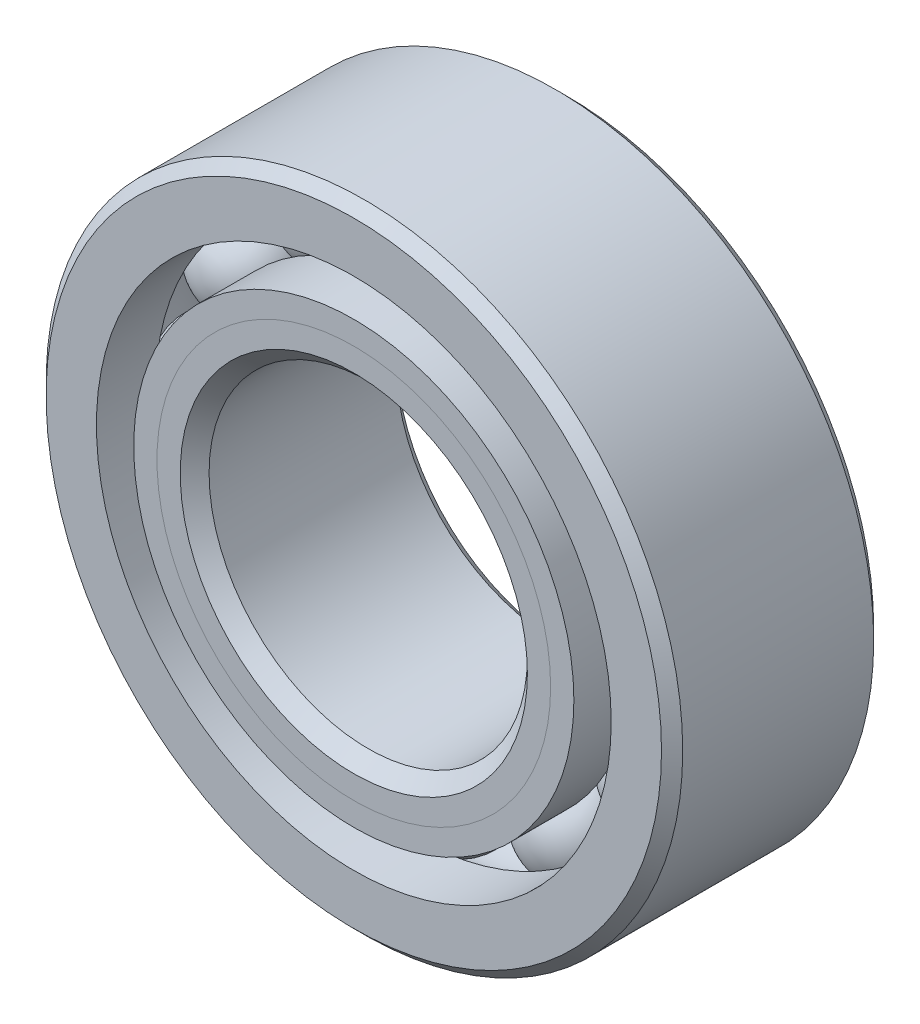
ISO-10303-21;
HEADER;
FILE_DESCRIPTION(('STEP AP214'),'2;1');
FILE_NAME('part.step','',(''),(''),'','','');
FILE_SCHEMA(('AUTOMOTIVE_DESIGN { 1 0 10303 214 1 1 1 1 }'));
ENDSEC;
DATA;
#1=APPLICATION_CONTEXT('core data for automotive mechanical design processes');
#2=APPLICATION_PROTOCOL_DEFINITION('international standard','automotive_design',2000,#1);
#3=PRODUCT_CONTEXT('',#1,'mechanical');
#4=PRODUCT('Part','Part','',(#3));
#5=PRODUCT_RELATED_PRODUCT_CATEGORY('part','',(#4));
#6=PRODUCT_DEFINITION_FORMATION('','',#4);
#7=PRODUCT_DEFINITION_CONTEXT('part definition',#1,'design');
#8=PRODUCT_DEFINITION('design','',#6,#7);
#9=PRODUCT_DEFINITION_SHAPE('','',#8);
#10=(LENGTH_UNIT() NAMED_UNIT(*) SI_UNIT(.MILLI.,.METRE.));
#11=(NAMED_UNIT(*) PLANE_ANGLE_UNIT() SI_UNIT($,.RADIAN.));
#12=(NAMED_UNIT(*) SI_UNIT($,.STERADIAN.) SOLID_ANGLE_UNIT());
#13=UNCERTAINTY_MEASURE_WITH_UNIT(LENGTH_MEASURE(1.E-05),#10,'distance_accuracy_value','');
#14=(GEOMETRIC_REPRESENTATION_CONTEXT(3) GLOBAL_UNCERTAINTY_ASSIGNED_CONTEXT((#13)) GLOBAL_UNIT_ASSIGNED_CONTEXT((#10,
#11,#12)) REPRESENTATION_CONTEXT('',''));
#15=CARTESIAN_POINT('',(0.,0.,0.));
#16=DIRECTION('',(0.,0.,1.));
#17=DIRECTION('',(1.,0.,0.));
#18=AXIS2_PLACEMENT_3D('',#15,#16,#17);
#19=CARTESIAN_POINT('',(-1.78593749999996,3.09333448914257,0.));
#20=DIRECTION('',(0.,0.,1.));
#21=DIRECTION('',(-0.499999999999989,0.866025403784445,0.));
#22=AXIS2_PLACEMENT_3D('',#19,#20,#21);
#23=SPHERICAL_SURFACE('',#22,0.758760243513404);
#24=CARTESIAN_POINT('',(-1.78593749999996,3.09333448914257,0.758760243513404));
#25=VERTEX_POINT('',#24);
#26=VERTEX_LOOP('',#25);
#27=FACE_BOUND('',#26,.T.);
#28=ADVANCED_FACE('F46',(#27),#23,.T.);
#29=CLOSED_SHELL('',(#28));
#30=MANIFOLD_SOLID_BREP('B2',#29);
#31=CARTESIAN_POINT('',(-3.09333448914252,1.78593750000004,0.));
#32=DIRECTION('',(0.,0.,1.));
#33=DIRECTION('',(-0.866025403784433,0.50000000000001,0.));
#34=AXIS2_PLACEMENT_3D('',#31,#32,#33);
#35=SPHERICAL_SURFACE('',#34,0.758760243513404);
#36=CARTESIAN_POINT('',(-3.09333448914252,1.78593750000004,0.758760243513404));
#37=VERTEX_POINT('',#36);
#38=VERTEX_LOOP('',#37);
#39=FACE_BOUND('',#38,.T.);
#40=ADVANCED_FACE('F83',(#39),#35,.T.);
#41=CLOSED_SHELL('',(#40));
#42=MANIFOLD_SOLID_BREP('B6',#41);
#43=CARTESIAN_POINT('',(-3.571875,0.,0.));
#44=DIRECTION('',(0.,0.,1.));
#45=DIRECTION('',(-1.,0.,0.));
#46=AXIS2_PLACEMENT_3D('',#43,#44,#45);
#47=SPHERICAL_SURFACE('',#46,0.758760243513404);
#48=CARTESIAN_POINT('',(-3.571875,0.,0.758760243513404));
#49=VERTEX_POINT('',#48);
#50=VERTEX_LOOP('',#49);
#51=FACE_BOUND('',#50,.T.);
#52=ADVANCED_FACE('F120',(#51),#47,.T.);
#53=CLOSED_SHELL('',(#52));
#54=MANIFOLD_SOLID_BREP('B42',#53);
#55=CARTESIAN_POINT('',(-3.09333448914256,-1.78593749999997,0.));
#56=DIRECTION('',(0.,0.,1.));
#57=DIRECTION('',(-0.866025403784443,-0.499999999999992,0.));
#58=AXIS2_PLACEMENT_3D('',#55,#56,#57);
#59=SPHERICAL_SURFACE('',#58,0.758760243513404);
#60=CARTESIAN_POINT('',(-3.09333448914256,-1.78593749999997,0.758760243513404));
#61=VERTEX_POINT('',#60);
#62=VERTEX_LOOP('',#61);
#63=FACE_BOUND('',#62,.T.);
#64=ADVANCED_FACE('F157',(#63),#59,.T.);
#65=CLOSED_SHELL('',(#64));
#66=MANIFOLD_SOLID_BREP('B79',#65);
#67=CARTESIAN_POINT('',(-1.78593750000003,-3.09333448914253,0.));
#68=DIRECTION('',(0.,0.,1.));
#69=DIRECTION('',(-0.500000000000007,-0.866025403784435,0.));
#70=AXIS2_PLACEMENT_3D('',#67,#68,#69);
#71=SPHERICAL_SURFACE('',#70,0.758760243513404);
#72=CARTESIAN_POINT('',(-1.78593750000003,-3.09333448914253,0.758760243513404));
#73=VERTEX_POINT('',#72);
#74=VERTEX_LOOP('',#73);
#75=FACE_BOUND('',#74,.T.);
#76=ADVANCED_FACE('F194',(#75),#71,.T.);
#77=CLOSED_SHELL('',(#76));
#78=MANIFOLD_SOLID_BREP('B116',#77);
#79=CARTESIAN_POINT('',(0.,-3.571875,0.));
#80=DIRECTION('',(0.,0.,1.));
#81=DIRECTION('',(0.,-1.,0.));
#82=AXIS2_PLACEMENT_3D('',#79,#80,#81);
#83=SPHERICAL_SURFACE('',#82,0.758760243513404);
#84=CARTESIAN_POINT('',(0.,-3.571875,0.758760243513404));
#85=VERTEX_POINT('',#84);
#86=VERTEX_LOOP('',#85);
#87=FACE_BOUND('',#86,.T.);
#88=ADVANCED_FACE('F231',(#87),#83,.T.);
#89=CLOSED_SHELL('',(#88));
#90=MANIFOLD_SOLID_BREP('B153',#89);
#91=CARTESIAN_POINT('',(1.78593749999998,-3.09333448914255,0.));
#92=DIRECTION('',(0.,0.,1.));
#93=DIRECTION('',(0.499999999999995,-0.866025403784442,0.));
#94=AXIS2_PLACEMENT_3D('',#91,#92,#93);
#95=SPHERICAL_SURFACE('',#94,0.758760243513404);
#96=CARTESIAN_POINT('',(1.78593749999998,-3.09333448914255,0.758760243513404));
#97=VERTEX_POINT('',#96);
#98=VERTEX_LOOP('',#97);
#99=FACE_BOUND('',#98,.T.);
#100=ADVANCED_FACE('F268',(#99),#95,.T.);
#101=CLOSED_SHELL('',(#100));
#102=MANIFOLD_SOLID_BREP('B190',#101);
#103=CARTESIAN_POINT('',(3.09333448914253,-1.78593750000001,0.));
#104=DIRECTION('',(0.,0.,1.));
#105=DIRECTION('',(0.866025403784436,-0.500000000000004,0.));
#106=AXIS2_PLACEMENT_3D('',#103,#104,#105);
#107=SPHERICAL_SURFACE('',#106,0.758760243513404);
#108=CARTESIAN_POINT('',(3.09333448914253,-1.78593750000001,0.758760243513404));
#109=VERTEX_POINT('',#108);
#110=VERTEX_LOOP('',#109);
#111=FACE_BOUND('',#110,.T.);
#112=ADVANCED_FACE('F305',(#111),#107,.T.);
#113=CLOSED_SHELL('',(#112));
#114=MANIFOLD_SOLID_BREP('B227',#113);
#115=CARTESIAN_POINT('',(3.571875,0.,0.));
#116=DIRECTION('',(0.,0.,1.));
#117=DIRECTION('',(1.,0.,0.));
#118=AXIS2_PLACEMENT_3D('',#115,#116,#117);
#119=SPHERICAL_SURFACE('',#118,0.758760243513404);
#120=CARTESIAN_POINT('',(3.571875,0.,0.758760243513404));
#121=VERTEX_POINT('',#120);
#122=VERTEX_LOOP('',#121);
#123=FACE_BOUND('',#122,.T.);
#124=ADVANCED_FACE('F342',(#123),#119,.T.);
#125=CLOSED_SHELL('',(#124));
#126=MANIFOLD_SOLID_BREP('B264',#125);
#127=CARTESIAN_POINT('',(3.09333448914255,1.78593749999999,0.));
#128=DIRECTION('',(0.,0.,1.));
#129=DIRECTION('',(0.86602540378444,0.499999999999998,0.));
#130=AXIS2_PLACEMENT_3D('',#127,#128,#129);
#131=SPHERICAL_SURFACE('',#130,0.758760243513404);
#132=CARTESIAN_POINT('',(3.09333448914255,1.78593749999999,0.758760243513404));
#133=VERTEX_POINT('',#132);
#134=VERTEX_LOOP('',#133);
#135=FACE_BOUND('',#134,.T.);
#136=ADVANCED_FACE('F379',(#135),#131,.T.);
#137=CLOSED_SHELL('',(#136));
#138=MANIFOLD_SOLID_BREP('B301',#137);
#139=CARTESIAN_POINT('',(1.7859375,3.09333448914254,0.));
#140=DIRECTION('',(0.,0.,1.));
#141=DIRECTION('',(0.500000000000001,0.866025403784438,0.));
#142=AXIS2_PLACEMENT_3D('',#139,#140,#141);
#143=SPHERICAL_SURFACE('',#142,0.758760243513404);
#144=CARTESIAN_POINT('',(1.7859375,3.09333448914254,0.758760243513404));
#145=VERTEX_POINT('',#144);
#146=VERTEX_LOOP('',#145);
#147=FACE_BOUND('',#146,.T.);
#148=ADVANCED_FACE('F416',(#147),#143,.T.);
#149=CLOSED_SHELL('',(#148));
#150=MANIFOLD_SOLID_BREP('B338',#149);
#151=CARTESIAN_POINT('',(0.,3.571875,0.));
#152=DIRECTION('',(0.,0.,1.));
#153=DIRECTION('',(0.,1.,0.));
#154=AXIS2_PLACEMENT_3D('',#151,#152,#153);
#155=SPHERICAL_SURFACE('',#154,0.758760243513404);
#156=CARTESIAN_POINT('',(0.,3.571875,0.758760243513404));
#157=VERTEX_POINT('',#156);
#158=VERTEX_LOOP('',#157);
#159=FACE_BOUND('',#158,.T.);
#160=ADVANCED_FACE('F455',(#159),#155,.T.);
#161=CLOSED_SHELL('',(#160));
#162=MANIFOLD_SOLID_BREP('B375',#161);
#163=CARTESIAN_POINT('',(0.,2.94496824956121,1.5875));
#164=DIRECTION('',(0.,0.,-1.));
#165=DIRECTION('',(-1.,0.,0.));
#166=AXIS2_PLACEMENT_3D('',#163,#164,#165);
#167=PLANE('',#166);
#168=CARTESIAN_POINT('',(0.,0.,1.5875));
#169=DIRECTION('',(0.,0.,1.));
#170=DIRECTION('',(1.,0.,0.));
#171=AXIS2_PLACEMENT_3D('',#168,#169,#170);
#172=CIRCLE('',#171,2.5971823782433);
#173=CARTESIAN_POINT('',(2.5971823782433,0.,1.5875));
#174=VERTEX_POINT('',#173);
#175=EDGE_CURVE('E521',#174,#174,#172,.T.);
#176=ORIENTED_EDGE('',*,*,#175,.F.);
#177=EDGE_LOOP('',(#176));
#178=FACE_BOUND('',#177,.T.);
#179=CARTESIAN_POINT('',(0.,0.,1.5875));
#180=DIRECTION('',(0.,0.,1.));
#181=DIRECTION('',(1.,0.,0.));
#182=AXIS2_PLACEMENT_3D('',#179,#180,#181);
#183=CIRCLE('',#182,2.94496824956121);
#184=CARTESIAN_POINT('',(2.94496824956121,0.,1.5875));
#185=VERTEX_POINT('',#184);
#186=EDGE_CURVE('E454',#185,#185,#183,.T.);
#187=ORIENTED_EDGE('',*,*,#186,.T.);
#188=EDGE_LOOP('',(#187));
#189=FACE_BOUND('',#188,.T.);
#190=ADVANCED_FACE('F476',(#178,#189),#167,.F.);
#191=CARTESIAN_POINT('',(0.,0.,1.23971412868209));
#192=DIRECTION('',(0.,0.,1.));
#193=DIRECTION('',(1.,0.,0.));
#194=AXIS2_PLACEMENT_3D('',#191,#192,#193);
#195=CONICAL_SURFACE('',#194,2.5971823782433,0.78539816339745);
#196=ORIENTED_EDGE('',*,*,#186,.F.);
#197=EDGE_LOOP('',(#196));
#198=FACE_BOUND('',#197,.T.);
#199=CARTESIAN_POINT('',(0.,0.,1.23971412868209));
#200=DIRECTION('',(0.,0.,1.));
#201=DIRECTION('',(1.,0.,0.));
#202=AXIS2_PLACEMENT_3D('',#199,#200,#201);
#203=CIRCLE('',#202,2.5971823782433);
#204=CARTESIAN_POINT('',(2.5971823782433,0.,1.23971412868209));
#205=VERTEX_POINT('',#204);
#206=EDGE_CURVE('E483',#205,#205,#203,.T.);
#207=ORIENTED_EDGE('',*,*,#206,.T.);
#208=EDGE_LOOP('',(#207));
#209=FACE_BOUND('',#208,.T.);
#210=ADVANCED_FACE('F530',(#198,#209),#195,.T.);
#211=CARTESIAN_POINT('',(0.,0.,1.5875));
#212=DIRECTION('',(0.,0.,1.));
#213=DIRECTION('',(1.,0.,0.));
#214=AXIS2_PLACEMENT_3D('',#211,#212,#213);
#215=CYLINDRICAL_SURFACE('',#214,2.5971823782433);
#216=ORIENTED_EDGE('',*,*,#206,.F.);
#217=EDGE_LOOP('',(#216));
#218=FACE_BOUND('',#217,.T.);
#219=CARTESIAN_POINT('',(0.,0.,0.));
#220=DIRECTION('',(0.,0.,1.));
#221=DIRECTION('',(1.,0.,0.));
#222=AXIS2_PLACEMENT_3D('',#219,#220,#221);
#223=CIRCLE('',#222,2.5971823782433);
#224=CARTESIAN_POINT('',(2.5971823782433,0.,0.));
#225=VERTEX_POINT('',#224);
#226=EDGE_CURVE('E489',#225,#225,#223,.T.);
#227=ORIENTED_EDGE('',*,*,#226,.T.);
#228=EDGE_LOOP('',(#227));
#229=FACE_BOUND('',#228,.T.);
#230=ADVANCED_FACE('F534',(#218,#229),#215,.T.);
#231=CARTESIAN_POINT('',(0.,2.5971823782433,0.));
#232=DIRECTION('',(0.,0.,-1.));
#233=DIRECTION('',(-1.,0.,0.));
#234=AXIS2_PLACEMENT_3D('',#231,#232,#233);
#235=PLANE('',#234);
#236=ORIENTED_EDGE('',*,*,#226,.F.);
#237=EDGE_LOOP('',(#236));
#238=FACE_BOUND('',#237,.T.);
#239=CARTESIAN_POINT('',(0.,0.,0.));
#240=DIRECTION('',(0.,0.,1.));
#241=DIRECTION('',(1.,0.,0.));
#242=AXIS2_PLACEMENT_3D('',#239,#240,#241);
#243=CIRCLE('',#242,2.8131147564866);
#244=CARTESIAN_POINT('',(2.8131147564866,0.,0.));
#245=VERTEX_POINT('',#244);
#246=EDGE_CURVE('E495',#245,#245,#243,.T.);
#247=ORIENTED_EDGE('',*,*,#246,.T.);
#248=EDGE_LOOP('',(#247));
#249=FACE_BOUND('',#248,.T.);
#250=ADVANCED_FACE('F539',(#238,#249),#235,.F.);
#251=CARTESIAN_POINT('',(0.,0.,0.));
#252=DIRECTION('',(0.,0.,1.));
#253=DIRECTION('',(1.,0.,0.));
#254=AXIS2_PLACEMENT_3D('',#251,#252,#253);
#255=TOROIDAL_SURFACE('',#254,3.571875,0.758760243513404);
#256=ORIENTED_EDGE('',*,*,#246,.F.);
#257=EDGE_LOOP('',(#256));
#258=FACE_BOUND('',#257,.T.);
#259=CARTESIAN_POINT('',(0.,0.,-0.705555555555556));
#260=DIRECTION('',(0.,0.,1.));
#261=DIRECTION('',(1.,0.,0.));
#262=AXIS2_PLACEMENT_3D('',#259,#260,#261);
#263=CIRCLE('',#262,3.29275412087912);
#264=CARTESIAN_POINT('',(3.29275412087912,0.,-0.705555555555556));
#265=VERTEX_POINT('',#264);
#266=EDGE_CURVE('E501',#265,#265,#263,.T.);
#267=ORIENTED_EDGE('',*,*,#266,.T.);
#268=EDGE_LOOP('',(#267));
#269=FACE_BOUND('',#268,.T.);
#270=ADVANCED_FACE('F545',(#258,#269),#255,.F.);
#271=CARTESIAN_POINT('',(0.,0.,1.5875));
#272=DIRECTION('',(0.,0.,1.));
#273=DIRECTION('',(1.,0.,0.));
#274=AXIS2_PLACEMENT_3D('',#271,#272,#273);
#275=CYLINDRICAL_SURFACE('',#274,3.29275412087912);
#276=ORIENTED_EDGE('',*,*,#266,.F.);
#277=EDGE_LOOP('',(#276));
#278=FACE_BOUND('',#277,.T.);
#279=CARTESIAN_POINT('',(0.,0.,-1.5875));
#280=DIRECTION('',(0.,0.,1.));
#281=DIRECTION('',(1.,0.,0.));
#282=AXIS2_PLACEMENT_3D('',#279,#280,#281);
#283=CIRCLE('',#282,3.29275412087912);
#284=CARTESIAN_POINT('',(3.29275412087912,0.,-1.5875));
#285=VERTEX_POINT('',#284);
#286=EDGE_CURVE('E505',#285,#285,#283,.T.);
#287=ORIENTED_EDGE('',*,*,#286,.T.);
#288=EDGE_LOOP('',(#287));
#289=FACE_BOUND('',#288,.T.);
#290=ADVANCED_FACE('F549',(#278,#289),#275,.T.);
#291=CARTESIAN_POINT('',(0.,2.54,-1.5875));
#292=DIRECTION('',(0.,0.,1.));
#293=DIRECTION('',(1.,0.,0.));
#294=AXIS2_PLACEMENT_3D('',#291,#292,#293);
#295=PLANE('',#294);
#296=ORIENTED_EDGE('',*,*,#286,.F.);
#297=EDGE_LOOP('',(#296));
#298=FACE_BOUND('',#297,.T.);
#299=CARTESIAN_POINT('',(0.,0.,-1.5875));
#300=DIRECTION('',(0.,0.,1.));
#301=DIRECTION('',(1.,0.,0.));
#302=AXIS2_PLACEMENT_3D('',#299,#300,#301);
#303=CIRCLE('',#302,2.54);
#304=CARTESIAN_POINT('',(2.54,0.,-1.5875));
#305=VERTEX_POINT('',#304);
#306=EDGE_CURVE('E509',#305,#305,#303,.T.);
#307=ORIENTED_EDGE('',*,*,#306,.T.);
#308=EDGE_LOOP('',(#307));
#309=FACE_BOUND('',#308,.T.);
#310=ADVANCED_FACE('F553',(#298,#309),#295,.F.);
#311=CARTESIAN_POINT('',(0.,0.,-1.42875));
#312=DIRECTION('',(0.,0.,-1.));
#313=DIRECTION('',(-1.,0.,0.));
#314=AXIS2_PLACEMENT_3D('',#311,#312,#313);
#315=CONICAL_SURFACE('',#314,2.38125,0.785398163397447);
#316=ORIENTED_EDGE('',*,*,#306,.F.);
#317=EDGE_LOOP('',(#316));
#318=FACE_BOUND('',#317,.T.);
#319=CARTESIAN_POINT('',(0.,0.,-1.42875));
#320=DIRECTION('',(0.,0.,1.));
#321=DIRECTION('',(1.,0.,0.));
#322=AXIS2_PLACEMENT_3D('',#319,#320,#321);
#323=CIRCLE('',#322,2.38125);
#324=CARTESIAN_POINT('',(2.38125,0.,-1.42875));
#325=VERTEX_POINT('',#324);
#326=EDGE_CURVE('E513',#325,#325,#323,.T.);
#327=ORIENTED_EDGE('',*,*,#326,.T.);
#328=EDGE_LOOP('',(#327));
#329=FACE_BOUND('',#328,.T.);
#330=ADVANCED_FACE('F557',(#318,#329),#315,.F.);
#331=CARTESIAN_POINT('',(0.,0.,1.5875));
#332=DIRECTION('',(0.,0.,1.));
#333=DIRECTION('',(1.,0.,0.));
#334=AXIS2_PLACEMENT_3D('',#331,#332,#333);
#335=CYLINDRICAL_SURFACE('',#334,2.38125);
#336=ORIENTED_EDGE('',*,*,#326,.F.);
#337=EDGE_LOOP('',(#336));
#338=FACE_BOUND('',#337,.T.);
#339=CARTESIAN_POINT('',(0.,0.,1.3715676217567));
#340=DIRECTION('',(0.,0.,1.));
#341=DIRECTION('',(1.,0.,0.));
#342=AXIS2_PLACEMENT_3D('',#339,#340,#341);
#343=CIRCLE('',#342,2.38125);
#344=CARTESIAN_POINT('',(2.38125,0.,1.3715676217567));
#345=VERTEX_POINT('',#344);
#346=EDGE_CURVE('E517',#345,#345,#343,.T.);
#347=ORIENTED_EDGE('',*,*,#346,.T.);
#348=EDGE_LOOP('',(#347));
#349=FACE_BOUND('',#348,.T.);
#350=ADVANCED_FACE('F561',(#338,#349),#335,.F.);
#351=CARTESIAN_POINT('',(0.,0.,1.5875));
#352=DIRECTION('',(0.,0.,1.));
#353=DIRECTION('',(1.,0.,0.));
#354=AXIS2_PLACEMENT_3D('',#351,#352,#353);
#355=CONICAL_SURFACE('',#354,2.5971823782433,0.785398163397451);
#356=ORIENTED_EDGE('',*,*,#346,.F.);
#357=EDGE_LOOP('',(#356));
#358=FACE_BOUND('',#357,.T.);
#359=ORIENTED_EDGE('',*,*,#175,.T.);
#360=EDGE_LOOP('',(#359));
#361=FACE_BOUND('',#360,.T.);
#362=ADVANCED_FACE('F527',(#358,#361),#355,.F.);
#363=CLOSED_SHELL('',(#190,#210,#230,#250,#270,#290,#310,#330,#350,#362));
#364=MANIFOLD_SOLID_BREP('B412',#363);
#365=CARTESIAN_POINT('',(0.,3.29275412087912,1.5875));
#366=DIRECTION('',(0.,0.,-1.));
#367=DIRECTION('',(-1.,0.,0.));
#368=AXIS2_PLACEMENT_3D('',#365,#366,#367);
#369=PLANE('',#368);
#370=CARTESIAN_POINT('',(0.,0.,1.5875));
#371=DIRECTION('',(0.,0.,1.));
#372=DIRECTION('',(1.,0.,0.));
#373=AXIS2_PLACEMENT_3D('',#370,#371,#372);
#374=CIRCLE('',#373,2.94496824956121);
#375=CARTESIAN_POINT('',(2.94496824956121,0.,1.5875));
#376=VERTEX_POINT('',#375);
#377=EDGE_CURVE('E475',#376,#376,#374,.T.);
#378=ORIENTED_EDGE('',*,*,#377,.F.);
#379=EDGE_LOOP('',(#378));
#380=FACE_BOUND('',#379,.T.);
#381=CARTESIAN_POINT('',(0.,0.,1.5875));
#382=DIRECTION('',(0.,0.,1.));
#383=DIRECTION('',(1.,0.,0.));
#384=AXIS2_PLACEMENT_3D('',#381,#382,#383);
#385=CIRCLE('',#384,3.29275412087912);
#386=CARTESIAN_POINT('',(3.29275412087912,0.,1.5875));
#387=VERTEX_POINT('',#386);
#388=EDGE_CURVE('E684',#387,#387,#385,.T.);
#389=ORIENTED_EDGE('',*,*,#388,.T.);
#390=EDGE_LOOP('',(#389));
#391=FACE_BOUND('',#390,.T.);
#392=ADVANCED_FACE('F655',(#380,#391),#369,.F.);
#393=CARTESIAN_POINT('',(0.,0.,1.5875));
#394=DIRECTION('',(0.,0.,1.));
#395=DIRECTION('',(1.,0.,0.));
#396=AXIS2_PLACEMENT_3D('',#393,#394,#395);
#397=CONICAL_SURFACE('',#396,2.94496824956121,0.78539816339745);
#398=CARTESIAN_POINT('',(0.,0.,1.23971412868209));
#399=DIRECTION('',(0.,0.,1.));
#400=DIRECTION('',(1.,0.,0.));
#401=AXIS2_PLACEMENT_3D('',#398,#399,#400);
#402=CIRCLE('',#401,2.5971823782433);
#403=CARTESIAN_POINT('',(2.5971823782433,0.,1.23971412868209));
#404=VERTEX_POINT('',#403);
#405=EDGE_CURVE('E662',#404,#404,#402,.T.);
#406=ORIENTED_EDGE('',*,*,#405,.F.);
#407=EDGE_LOOP('',(#406));
#408=FACE_BOUND('',#407,.T.);
#409=ORIENTED_EDGE('',*,*,#377,.T.);
#410=EDGE_LOOP('',(#409));
#411=FACE_BOUND('',#410,.T.);
#412=ADVANCED_FACE('F711',(#408,#411),#397,.F.);
#413=CARTESIAN_POINT('',(0.,0.,1.5875));
#414=DIRECTION('',(0.,0.,1.));
#415=DIRECTION('',(1.,0.,0.));
#416=AXIS2_PLACEMENT_3D('',#413,#414,#415);
#417=CYLINDRICAL_SURFACE('',#416,2.5971823782433);
#418=CARTESIAN_POINT('',(0.,0.,0.));
#419=DIRECTION('',(0.,0.,1.));
#420=DIRECTION('',(1.,0.,0.));
#421=AXIS2_PLACEMENT_3D('',#418,#419,#420);
#422=CIRCLE('',#421,2.5971823782433);
#423=CARTESIAN_POINT('',(2.5971823782433,0.,0.));
#424=VERTEX_POINT('',#423);
#425=EDGE_CURVE('E668',#424,#424,#422,.T.);
#426=ORIENTED_EDGE('',*,*,#425,.F.);
#427=EDGE_LOOP('',(#426));
#428=FACE_BOUND('',#427,.T.);
#429=ORIENTED_EDGE('',*,*,#405,.T.);
#430=EDGE_LOOP('',(#429));
#431=FACE_BOUND('',#430,.T.);
#432=ADVANCED_FACE('F706',(#428,#431),#417,.F.);
#433=CARTESIAN_POINT('',(0.,2.5971823782433,0.));
#434=DIRECTION('',(0.,0.,1.));
#435=DIRECTION('',(1.,0.,0.));
#436=AXIS2_PLACEMENT_3D('',#433,#434,#435);
#437=PLANE('',#436);
#438=CARTESIAN_POINT('',(0.,0.,0.));
#439=DIRECTION('',(0.,0.,1.));
#440=DIRECTION('',(1.,0.,0.));
#441=AXIS2_PLACEMENT_3D('',#438,#439,#440);
#442=CIRCLE('',#441,2.8131147564866);
#443=CARTESIAN_POINT('',(2.8131147564866,0.,0.));
#444=VERTEX_POINT('',#443);
#445=EDGE_CURVE('E674',#444,#444,#442,.T.);
#446=ORIENTED_EDGE('',*,*,#445,.F.);
#447=EDGE_LOOP('',(#446));
#448=FACE_BOUND('',#447,.T.);
#449=ORIENTED_EDGE('',*,*,#425,.T.);
#450=EDGE_LOOP('',(#449));
#451=FACE_BOUND('',#450,.T.);
#452=ADVANCED_FACE('F700',(#448,#451),#437,.F.);
#453=CARTESIAN_POINT('',(0.,0.,0.));
#454=DIRECTION('',(0.,0.,1.));
#455=DIRECTION('',(1.,0.,0.));
#456=AXIS2_PLACEMENT_3D('',#453,#454,#455);
#457=TOROIDAL_SURFACE('',#456,3.571875,0.758760243513404);
#458=CARTESIAN_POINT('',(0.,0.,0.705555555555555));
#459=DIRECTION('',(0.,0.,1.));
#460=DIRECTION('',(1.,0.,0.));
#461=AXIS2_PLACEMENT_3D('',#458,#459,#460);
#462=CIRCLE('',#461,3.29275412087912);
#463=CARTESIAN_POINT('',(3.29275412087912,0.,0.705555555555555));
#464=VERTEX_POINT('',#463);
#465=EDGE_CURVE('E680',#464,#464,#462,.T.);
#466=ORIENTED_EDGE('',*,*,#465,.F.);
#467=EDGE_LOOP('',(#466));
#468=FACE_BOUND('',#467,.T.);
#469=ORIENTED_EDGE('',*,*,#445,.T.);
#470=EDGE_LOOP('',(#469));
#471=FACE_BOUND('',#470,.T.);
#472=ADVANCED_FACE('F694',(#468,#471),#457,.F.);
#473=CARTESIAN_POINT('',(0.,0.,1.5875));
#474=DIRECTION('',(0.,0.,1.));
#475=DIRECTION('',(1.,0.,0.));
#476=AXIS2_PLACEMENT_3D('',#473,#474,#475);
#477=CYLINDRICAL_SURFACE('',#476,3.29275412087912);
#478=ORIENTED_EDGE('',*,*,#388,.F.);
#479=EDGE_LOOP('',(#478));
#480=FACE_BOUND('',#479,.T.);
#481=ORIENTED_EDGE('',*,*,#465,.T.);
#482=EDGE_LOOP('',(#481));
#483=FACE_BOUND('',#482,.T.);
#484=ADVANCED_FACE('F691',(#480,#483),#477,.T.);
#485=CLOSED_SHELL('',(#392,#412,#432,#452,#472,#484));
#486=MANIFOLD_SOLID_BREP('B449',#485);
#487=CARTESIAN_POINT('',(0.,0.,1.42875));
#488=DIRECTION('',(0.,0.,-1.));
#489=DIRECTION('',(-1.,0.,0.));
#490=AXIS2_PLACEMENT_3D('',#487,#488,#489);
#491=CONICAL_SURFACE('',#490,4.7625,0.785398163397448);
#492=CARTESIAN_POINT('',(0.,0.,1.5875));
#493=DIRECTION('',(0.,0.,1.));
#494=DIRECTION('',(1.,0.,0.));
#495=AXIS2_PLACEMENT_3D('',#492,#493,#494);
#496=CIRCLE('',#495,4.60375);
#497=CARTESIAN_POINT('',(4.60375,0.,1.5875));
#498=VERTEX_POINT('',#497);
#499=EDGE_CURVE('E796',#498,#498,#496,.T.);
#500=ORIENTED_EDGE('',*,*,#499,.F.);
#501=EDGE_LOOP('',(#500));
#502=FACE_BOUND('',#501,.T.);
#503=CARTESIAN_POINT('',(0.,0.,1.42875));
#504=DIRECTION('',(0.,0.,1.));
#505=DIRECTION('',(1.,0.,0.));
#506=AXIS2_PLACEMENT_3D('',#503,#504,#505);
#507=CIRCLE('',#506,4.7625);
#508=CARTESIAN_POINT('',(4.7625,0.,1.42875));
#509=VERTEX_POINT('',#508);
#510=EDGE_CURVE('E654',#509,#509,#507,.T.);
#511=ORIENTED_EDGE('',*,*,#510,.T.);
#512=EDGE_LOOP('',(#511));
#513=FACE_BOUND('',#512,.T.);
#514=ADVANCED_FACE('F759',(#502,#513),#491,.T.);
#515=CARTESIAN_POINT('',(0.,0.,1.5875));
#516=DIRECTION('',(0.,0.,1.));
#517=DIRECTION('',(1.,0.,0.));
#518=AXIS2_PLACEMENT_3D('',#515,#516,#517);
#519=CYLINDRICAL_SURFACE('',#518,4.7625);
#520=ORIENTED_EDGE('',*,*,#510,.F.);
#521=EDGE_LOOP('',(#520));
#522=FACE_BOUND('',#521,.T.);
#523=CARTESIAN_POINT('',(0.,0.,-1.42875));
#524=DIRECTION('',(0.,0.,1.));
#525=DIRECTION('',(1.,0.,0.));
#526=AXIS2_PLACEMENT_3D('',#523,#524,#525);
#527=CIRCLE('',#526,4.7625);
#528=CARTESIAN_POINT('',(4.7625,0.,-1.42875));
#529=VERTEX_POINT('',#528);
#530=EDGE_CURVE('E766',#529,#529,#527,.T.);
#531=ORIENTED_EDGE('',*,*,#530,.T.);
#532=EDGE_LOOP('',(#531));
#533=FACE_BOUND('',#532,.T.);
#534=ADVANCED_FACE('F805',(#522,#533),#519,.T.);
#535=CARTESIAN_POINT('',(0.,0.,-1.5875));
#536=DIRECTION('',(0.,0.,1.));
#537=DIRECTION('',(1.,0.,0.));
#538=AXIS2_PLACEMENT_3D('',#535,#536,#537);
#539=CONICAL_SURFACE('',#538,4.60375,0.785398163397447);
#540=ORIENTED_EDGE('',*,*,#530,.F.);
#541=EDGE_LOOP('',(#540));
#542=FACE_BOUND('',#541,.T.);
#543=CARTESIAN_POINT('',(0.,0.,-1.5875));
#544=DIRECTION('',(0.,0.,1.));
#545=DIRECTION('',(1.,0.,0.));
#546=AXIS2_PLACEMENT_3D('',#543,#544,#545);
#547=CIRCLE('',#546,4.60375);
#548=CARTESIAN_POINT('',(4.60375,0.,-1.5875));
#549=VERTEX_POINT('',#548);
#550=EDGE_CURVE('E772',#549,#549,#547,.T.);
#551=ORIENTED_EDGE('',*,*,#550,.T.);
#552=EDGE_LOOP('',(#551));
#553=FACE_BOUND('',#552,.T.);
#554=ADVANCED_FACE('F809',(#542,#553),#539,.T.);
#555=CARTESIAN_POINT('',(0.,4.60375,-1.5875));
#556=DIRECTION('',(0.,0.,1.));
#557=DIRECTION('',(1.,0.,0.));
#558=AXIS2_PLACEMENT_3D('',#555,#556,#557);
#559=PLANE('',#558);
#560=ORIENTED_EDGE('',*,*,#550,.F.);
#561=EDGE_LOOP('',(#560));
#562=FACE_BOUND('',#561,.T.);
#563=CARTESIAN_POINT('',(0.,0.,-1.5875));
#564=DIRECTION('',(0.,0.,1.));
#565=DIRECTION('',(1.,0.,0.));
#566=AXIS2_PLACEMENT_3D('',#563,#564,#565);
#567=CIRCLE('',#566,3.85099587912088);
#568=CARTESIAN_POINT('',(3.85099587912088,0.,-1.5875));
#569=VERTEX_POINT('',#568);
#570=EDGE_CURVE('E778',#569,#569,#567,.T.);
#571=ORIENTED_EDGE('',*,*,#570,.T.);
#572=EDGE_LOOP('',(#571));
#573=FACE_BOUND('',#572,.T.);
#574=ADVANCED_FACE('F814',(#562,#573),#559,.F.);
#575=CARTESIAN_POINT('',(0.,0.,1.5875));
#576=DIRECTION('',(0.,0.,1.));
#577=DIRECTION('',(1.,0.,0.));
#578=AXIS2_PLACEMENT_3D('',#575,#576,#577);
#579=CYLINDRICAL_SURFACE('',#578,3.85099587912088);
#580=ORIENTED_EDGE('',*,*,#570,.F.);
#581=EDGE_LOOP('',(#580));
#582=FACE_BOUND('',#581,.T.);
#583=CARTESIAN_POINT('',(0.,0.,-0.705555555555556));
#584=DIRECTION('',(0.,0.,1.));
#585=DIRECTION('',(1.,0.,0.));
#586=AXIS2_PLACEMENT_3D('',#583,#584,#585);
#587=CIRCLE('',#586,3.85099587912088);
#588=CARTESIAN_POINT('',(3.85099587912088,0.,-0.705555555555556));
#589=VERTEX_POINT('',#588);
#590=EDGE_CURVE('E784',#589,#589,#587,.T.);
#591=ORIENTED_EDGE('',*,*,#590,.T.);
#592=EDGE_LOOP('',(#591));
#593=FACE_BOUND('',#592,.T.);
#594=ADVANCED_FACE('F820',(#582,#593),#579,.F.);
#595=CARTESIAN_POINT('',(0.,0.,0.));
#596=DIRECTION('',(0.,0.,1.));
#597=DIRECTION('',(1.,0.,0.));
#598=AXIS2_PLACEMENT_3D('',#595,#596,#597);
#599=TOROIDAL_SURFACE('',#598,3.571875,0.758760243513404);
#600=ORIENTED_EDGE('',*,*,#590,.F.);
#601=EDGE_LOOP('',(#600));
#602=FACE_BOUND('',#601,.T.);
#603=CARTESIAN_POINT('',(0.,0.,0.705555555555555));
#604=DIRECTION('',(0.,0.,1.));
#605=DIRECTION('',(1.,0.,0.));
#606=AXIS2_PLACEMENT_3D('',#603,#604,#605);
#607=CIRCLE('',#606,3.85099587912088);
#608=CARTESIAN_POINT('',(3.85099587912088,0.,0.705555555555555));
#609=VERTEX_POINT('',#608);
#610=EDGE_CURVE('E788',#609,#609,#607,.T.);
#611=ORIENTED_EDGE('',*,*,#610,.T.);
#612=EDGE_LOOP('',(#611));
#613=FACE_BOUND('',#612,.T.);
#614=ADVANCED_FACE('F824',(#602,#613),#599,.F.);
#615=CARTESIAN_POINT('',(0.,0.,1.5875));
#616=DIRECTION('',(0.,0.,1.));
#617=DIRECTION('',(1.,0.,0.));
#618=AXIS2_PLACEMENT_3D('',#615,#616,#617);
#619=CYLINDRICAL_SURFACE('',#618,3.85099587912088);
#620=ORIENTED_EDGE('',*,*,#610,.F.);
#621=EDGE_LOOP('',(#620));
#622=FACE_BOUND('',#621,.T.);
#623=CARTESIAN_POINT('',(0.,0.,1.5875));
#624=DIRECTION('',(0.,0.,1.));
#625=DIRECTION('',(1.,0.,0.));
#626=AXIS2_PLACEMENT_3D('',#623,#624,#625);
#627=CIRCLE('',#626,3.85099587912088);
#628=CARTESIAN_POINT('',(3.85099587912088,0.,1.5875));
#629=VERTEX_POINT('',#628);
#630=EDGE_CURVE('E792',#629,#629,#627,.T.);
#631=ORIENTED_EDGE('',*,*,#630,.T.);
#632=EDGE_LOOP('',(#631));
#633=FACE_BOUND('',#632,.T.);
#634=ADVANCED_FACE('F828',(#622,#633),#619,.F.);
#635=CARTESIAN_POINT('',(0.,4.60375,1.5875));
#636=DIRECTION('',(0.,0.,-1.));
#637=DIRECTION('',(-1.,0.,0.));
#638=AXIS2_PLACEMENT_3D('',#635,#636,#637);
#639=PLANE('',#638);
#640=ORIENTED_EDGE('',*,*,#630,.F.);
#641=EDGE_LOOP('',(#640));
#642=FACE_BOUND('',#641,.T.);
#643=ORIENTED_EDGE('',*,*,#499,.T.);
#644=EDGE_LOOP('',(#643));
#645=FACE_BOUND('',#644,.T.);
#646=ADVANCED_FACE('F802',(#642,#645),#639,.F.);
#647=CLOSED_SHELL('',(#514,#534,#554,#574,#594,#614,#634,#646));
#648=MANIFOLD_SOLID_BREP('B470',#647);
#649=ADVANCED_BREP_SHAPE_REPRESENTATION('',(#18,#30,#42,#54,#66,#78,#90,#102,#114,#126,#138,
#150,#162,#364,#486,#648),#14);
#650=SHAPE_DEFINITION_REPRESENTATION(#9,#649);
ENDSEC;
END-ISO-10303-21;
